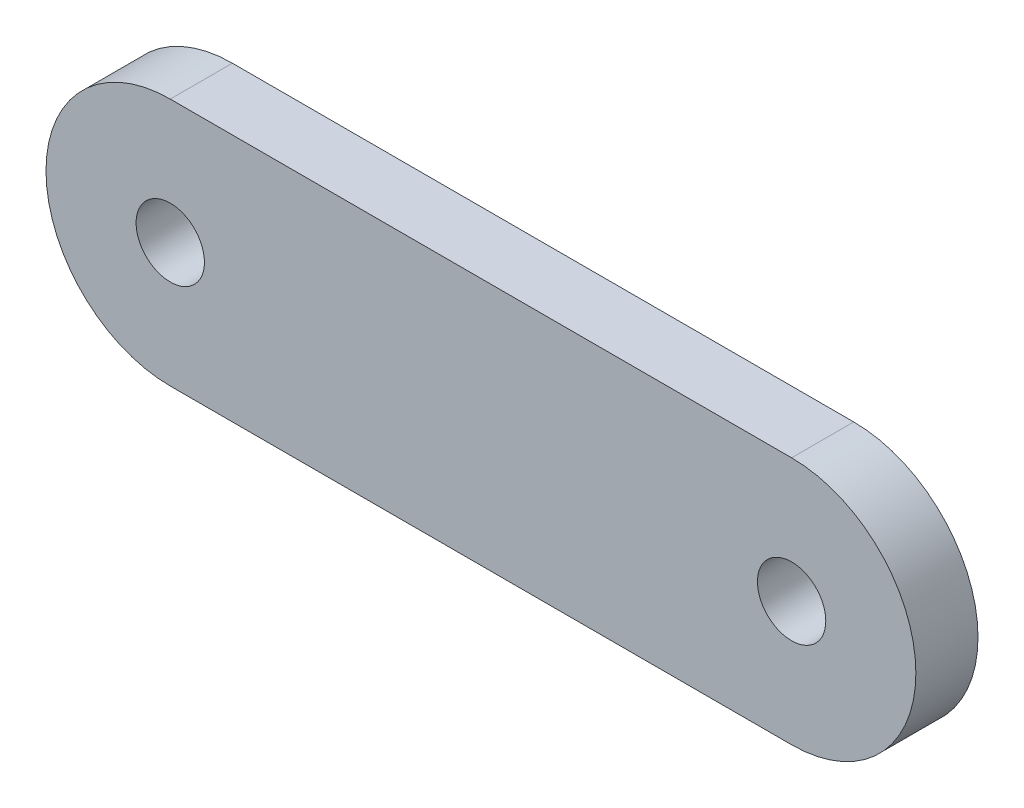
ISO-10303-21;
HEADER;
FILE_DESCRIPTION(('STEP AP214'),'2;1');
FILE_NAME('part.step','',(''),(''),'','','');
FILE_SCHEMA(('AUTOMOTIVE_DESIGN { 1 0 10303 214 1 1 1 1 }'));
ENDSEC;
DATA;
#1=APPLICATION_CONTEXT('core data for automotive mechanical design processes');
#2=APPLICATION_PROTOCOL_DEFINITION('international standard','automotive_design',2000,#1);
#3=PRODUCT_CONTEXT('',#1,'mechanical');
#4=PRODUCT('Part','Part','',(#3));
#5=PRODUCT_RELATED_PRODUCT_CATEGORY('part','',(#4));
#6=PRODUCT_DEFINITION_FORMATION('','',#4);
#7=PRODUCT_DEFINITION_CONTEXT('part definition',#1,'design');
#8=PRODUCT_DEFINITION('design','',#6,#7);
#9=PRODUCT_DEFINITION_SHAPE('','',#8);
#10=(LENGTH_UNIT() NAMED_UNIT(*) SI_UNIT(.MILLI.,.METRE.));
#11=(NAMED_UNIT(*) PLANE_ANGLE_UNIT() SI_UNIT($,.RADIAN.));
#12=(NAMED_UNIT(*) SI_UNIT($,.STERADIAN.) SOLID_ANGLE_UNIT());
#13=UNCERTAINTY_MEASURE_WITH_UNIT(LENGTH_MEASURE(1.E-05),#10,'distance_accuracy_value','');
#14=(GEOMETRIC_REPRESENTATION_CONTEXT(3) GLOBAL_UNCERTAINTY_ASSIGNED_CONTEXT((#13)) GLOBAL_UNIT_ASSIGNED_CONTEXT((#10,
#11,#12)) REPRESENTATION_CONTEXT('',''));
#15=CARTESIAN_POINT('',(0.,0.,0.));
#16=DIRECTION('',(0.,0.,1.));
#17=DIRECTION('',(1.,0.,0.));
#18=AXIS2_PLACEMENT_3D('',#15,#16,#17);
#19=CARTESIAN_POINT('',(0.,20.,10.));
#20=DIRECTION('',(0.,0.,1.));
#21=DIRECTION('',(1.,0.,0.));
#22=AXIS2_PLACEMENT_3D('',#19,#20,#21);
#23=PLANE('',#22);
#24=CARTESIAN_POINT('',(0.,20.,10.));
#25=DIRECTION('',(0.,0.,1.));
#26=DIRECTION('',(1.,0.,0.));
#27=AXIS2_PLACEMENT_3D('',#24,#25,#26);
#28=CIRCLE('',#27,5.5);
#29=CARTESIAN_POINT('',(5.5,20.,10.));
#30=VERTEX_POINT('',#29);
#31=EDGE_CURVE('E102',#30,#30,#28,.T.);
#32=ORIENTED_EDGE('',*,*,#31,.F.);
#33=EDGE_LOOP('',(#32));
#34=FACE_BOUND('',#33,.T.);
#35=CARTESIAN_POINT('',(0.,20.,10.));
#36=DIRECTION('',(0.,0.,1.));
#37=DIRECTION('',(1.,0.,0.));
#38=AXIS2_PLACEMENT_3D('',#35,#36,#37);
#39=CIRCLE('',#38,20.);
#40=CARTESIAN_POINT('',(0.,40.,10.));
#41=VERTEX_POINT('',#40);
#42=CARTESIAN_POINT('',(0.,0.,10.));
#43=VERTEX_POINT('',#42);
#44=EDGE_CURVE('E87',#41,#43,#39,.T.);
#45=ORIENTED_EDGE('',*,*,#44,.T.);
#46=DIRECTION('',(1.,0.,0.));
#47=VECTOR('',#46,1.);
#48=CARTESIAN_POINT('',(0.,0.,10.));
#49=LINE('',#48,#47);
#50=CARTESIAN_POINT('',(100.,0.,10.));
#51=VERTEX_POINT('',#50);
#52=EDGE_CURVE('E82',#43,#51,#49,.T.);
#53=ORIENTED_EDGE('',*,*,#52,.T.);
#54=CARTESIAN_POINT('',(100.,20.,10.));
#55=DIRECTION('',(0.,0.,1.));
#56=DIRECTION('',(1.,0.,0.));
#57=AXIS2_PLACEMENT_3D('',#54,#55,#56);
#58=CIRCLE('',#57,20.);
#59=CARTESIAN_POINT('',(100.,40.,10.));
#60=VERTEX_POINT('',#59);
#61=EDGE_CURVE('E85',#51,#60,#58,.T.);
#62=ORIENTED_EDGE('',*,*,#61,.T.);
#63=DIRECTION('',(-1.,0.,0.));
#64=VECTOR('',#63,1.);
#65=CARTESIAN_POINT('',(100.,40.,10.));
#66=LINE('',#65,#64);
#67=EDGE_CURVE('E52',#60,#41,#66,.T.);
#68=ORIENTED_EDGE('',*,*,#67,.T.);
#69=EDGE_LOOP('',(#45,#53,#62,#68));
#70=FACE_BOUND('',#69,.T.);
#71=CARTESIAN_POINT('',(100.,20.,10.));
#72=DIRECTION('',(0.,0.,1.));
#73=DIRECTION('',(1.,0.,0.));
#74=AXIS2_PLACEMENT_3D('',#71,#72,#73);
#75=CIRCLE('',#74,5.5);
#76=CARTESIAN_POINT('',(105.5,20.,10.));
#77=VERTEX_POINT('',#76);
#78=EDGE_CURVE('E117',#77,#77,#75,.T.);
#79=ORIENTED_EDGE('',*,*,#78,.F.);
#80=EDGE_LOOP('',(#79));
#81=FACE_BOUND('',#80,.T.);
#82=ADVANCED_FACE('F35',(#34,#70,#81),#23,.T.);
#83=CARTESIAN_POINT('',(0.,20.,0.));
#84=DIRECTION('',(0.,0.,1.));
#85=DIRECTION('',(1.,0.,0.));
#86=AXIS2_PLACEMENT_3D('',#83,#84,#85);
#87=PLANE('',#86);
#88=CARTESIAN_POINT('',(0.,20.,0.));
#89=DIRECTION('',(0.,0.,1.));
#90=DIRECTION('',(1.,0.,0.));
#91=AXIS2_PLACEMENT_3D('',#88,#89,#90);
#92=CIRCLE('',#91,20.);
#93=CARTESIAN_POINT('',(0.,40.,0.));
#94=VERTEX_POINT('',#93);
#95=CARTESIAN_POINT('',(0.,0.,0.));
#96=VERTEX_POINT('',#95);
#97=EDGE_CURVE('E99',#94,#96,#92,.T.);
#98=ORIENTED_EDGE('',*,*,#97,.F.);
#99=DIRECTION('',(-1.,0.,0.));
#100=VECTOR('',#99,1.);
#101=CARTESIAN_POINT('',(100.,40.,0.));
#102=LINE('',#101,#100);
#103=CARTESIAN_POINT('',(100.,40.,0.));
#104=VERTEX_POINT('',#103);
#105=EDGE_CURVE('E75',#104,#94,#102,.T.);
#106=ORIENTED_EDGE('',*,*,#105,.F.);
#107=CARTESIAN_POINT('',(100.,20.,0.));
#108=DIRECTION('',(0.,0.,1.));
#109=DIRECTION('',(1.,0.,0.));
#110=AXIS2_PLACEMENT_3D('',#107,#108,#109);
#111=CIRCLE('',#110,20.);
#112=CARTESIAN_POINT('',(100.,0.,0.));
#113=VERTEX_POINT('',#112);
#114=EDGE_CURVE('E69',#113,#104,#111,.T.);
#115=ORIENTED_EDGE('',*,*,#114,.F.);
#116=DIRECTION('',(1.,0.,0.));
#117=VECTOR('',#116,1.);
#118=CARTESIAN_POINT('',(0.,0.,0.));
#119=LINE('',#118,#117);
#120=EDGE_CURVE('E91',#96,#113,#119,.T.);
#121=ORIENTED_EDGE('',*,*,#120,.F.);
#122=EDGE_LOOP('',(#98,#106,#115,#121));
#123=FACE_BOUND('',#122,.T.);
#124=CARTESIAN_POINT('',(0.,20.,0.));
#125=DIRECTION('',(0.,0.,1.));
#126=DIRECTION('',(1.,0.,0.));
#127=AXIS2_PLACEMENT_3D('',#124,#125,#126);
#128=CIRCLE('',#127,5.5);
#129=CARTESIAN_POINT('',(5.5,20.,0.));
#130=VERTEX_POINT('',#129);
#131=EDGE_CURVE('E114',#130,#130,#128,.T.);
#132=ORIENTED_EDGE('',*,*,#131,.T.);
#133=EDGE_LOOP('',(#132));
#134=FACE_BOUND('',#133,.T.);
#135=CARTESIAN_POINT('',(100.,20.,0.));
#136=DIRECTION('',(0.,0.,1.));
#137=DIRECTION('',(1.,0.,0.));
#138=AXIS2_PLACEMENT_3D('',#135,#136,#137);
#139=CIRCLE('',#138,5.5);
#140=CARTESIAN_POINT('',(105.5,20.,0.));
#141=VERTEX_POINT('',#140);
#142=EDGE_CURVE('E120',#141,#141,#139,.T.);
#143=ORIENTED_EDGE('',*,*,#142,.T.);
#144=EDGE_LOOP('',(#143));
#145=FACE_BOUND('',#144,.T.);
#146=ADVANCED_FACE('F110',(#123,#134,#145),#87,.F.);
#147=CARTESIAN_POINT('',(0.,20.,10.));
#148=DIRECTION('',(0.,0.,-1.));
#149=DIRECTION('',(-1.,0.,0.));
#150=AXIS2_PLACEMENT_3D('',#147,#148,#149);
#151=CYLINDRICAL_SURFACE('',#150,20.);
#152=ORIENTED_EDGE('',*,*,#97,.T.);
#153=DIRECTION('',(0.,0.,-1.));
#154=VECTOR('',#153,1.);
#155=CARTESIAN_POINT('',(0.,0.,10.));
#156=LINE('',#155,#154);
#157=EDGE_CURVE('E11',#43,#96,#156,.T.);
#158=ORIENTED_EDGE('',*,*,#157,.F.);
#159=ORIENTED_EDGE('',*,*,#44,.F.);
#160=DIRECTION('',(0.,0.,-1.));
#161=VECTOR('',#160,1.);
#162=CARTESIAN_POINT('',(0.,40.,10.));
#163=LINE('',#162,#161);
#164=EDGE_CURVE('E95',#41,#94,#163,.T.);
#165=ORIENTED_EDGE('',*,*,#164,.T.);
#166=EDGE_LOOP('',(#152,#158,#159,#165));
#167=FACE_BOUND('',#166,.T.);
#168=ADVANCED_FACE('F37',(#167),#151,.T.);
#169=CARTESIAN_POINT('',(0.,0.,10.));
#170=DIRECTION('',(0.,1.,0.));
#171=DIRECTION('',(0.,0.,1.));
#172=AXIS2_PLACEMENT_3D('',#169,#170,#171);
#173=PLANE('',#172);
#174=ORIENTED_EDGE('',*,*,#120,.T.);
#175=DIRECTION('',(0.,0.,-1.));
#176=VECTOR('',#175,1.);
#177=CARTESIAN_POINT('',(100.,0.,10.));
#178=LINE('',#177,#176);
#179=EDGE_CURVE('E44',#51,#113,#178,.T.);
#180=ORIENTED_EDGE('',*,*,#179,.F.);
#181=ORIENTED_EDGE('',*,*,#52,.F.);
#182=ORIENTED_EDGE('',*,*,#157,.T.);
#183=EDGE_LOOP('',(#174,#180,#181,#182));
#184=FACE_BOUND('',#183,.T.);
#185=ADVANCED_FACE('F90',(#184),#173,.F.);
#186=CARTESIAN_POINT('',(100.,20.,10.));
#187=DIRECTION('',(0.,0.,-1.));
#188=DIRECTION('',(-1.,0.,0.));
#189=AXIS2_PLACEMENT_3D('',#186,#187,#188);
#190=CYLINDRICAL_SURFACE('',#189,20.);
#191=ORIENTED_EDGE('',*,*,#114,.T.);
#192=DIRECTION('',(0.,0.,-1.));
#193=VECTOR('',#192,1.);
#194=CARTESIAN_POINT('',(100.,40.,10.));
#195=LINE('',#194,#193);
#196=EDGE_CURVE('E92',#60,#104,#195,.T.);
#197=ORIENTED_EDGE('',*,*,#196,.F.);
#198=ORIENTED_EDGE('',*,*,#61,.F.);
#199=ORIENTED_EDGE('',*,*,#179,.T.);
#200=EDGE_LOOP('',(#191,#197,#198,#199));
#201=FACE_BOUND('',#200,.T.);
#202=ADVANCED_FACE('F93',(#201),#190,.T.);
#203=CARTESIAN_POINT('',(100.,40.,10.));
#204=DIRECTION('',(0.,-1.,0.));
#205=DIRECTION('',(1.,0.,0.));
#206=AXIS2_PLACEMENT_3D('',#203,#204,#205);
#207=PLANE('',#206);
#208=ORIENTED_EDGE('',*,*,#105,.T.);
#209=ORIENTED_EDGE('',*,*,#164,.F.);
#210=ORIENTED_EDGE('',*,*,#67,.F.);
#211=ORIENTED_EDGE('',*,*,#196,.T.);
#212=EDGE_LOOP('',(#208,#209,#210,#211));
#213=FACE_BOUND('',#212,.T.);
#214=ADVANCED_FACE('F107',(#213),#207,.F.);
#215=CARTESIAN_POINT('',(0.,20.,10.));
#216=DIRECTION('',(0.,0.,-1.));
#217=DIRECTION('',(-1.,0.,0.));
#218=AXIS2_PLACEMENT_3D('',#215,#216,#217);
#219=CYLINDRICAL_SURFACE('',#218,5.5);
#220=ORIENTED_EDGE('',*,*,#31,.T.);
#221=EDGE_LOOP('',(#220));
#222=FACE_BOUND('',#221,.T.);
#223=ORIENTED_EDGE('',*,*,#131,.F.);
#224=EDGE_LOOP('',(#223));
#225=FACE_BOUND('',#224,.T.);
#226=ADVANCED_FACE('F137',(#222,#225),#219,.F.);
#227=CARTESIAN_POINT('',(100.,20.,10.));
#228=DIRECTION('',(0.,0.,-1.));
#229=DIRECTION('',(-1.,0.,0.));
#230=AXIS2_PLACEMENT_3D('',#227,#228,#229);
#231=CYLINDRICAL_SURFACE('',#230,5.5);
#232=ORIENTED_EDGE('',*,*,#78,.T.);
#233=EDGE_LOOP('',(#232));
#234=FACE_BOUND('',#233,.T.);
#235=ORIENTED_EDGE('',*,*,#142,.F.);
#236=EDGE_LOOP('',(#235));
#237=FACE_BOUND('',#236,.T.);
#238=ADVANCED_FACE('F126',(#234,#237),#231,.F.);
#239=CLOSED_SHELL('',(#82,#146,#168,#185,#202,#214,#226,#238));
#240=MANIFOLD_SOLID_BREP('B2',#239);
#241=ADVANCED_BREP_SHAPE_REPRESENTATION('',(#18,#240),#14);
#242=SHAPE_DEFINITION_REPRESENTATION(#9,#241);
ENDSEC;
END-ISO-10303-21;
